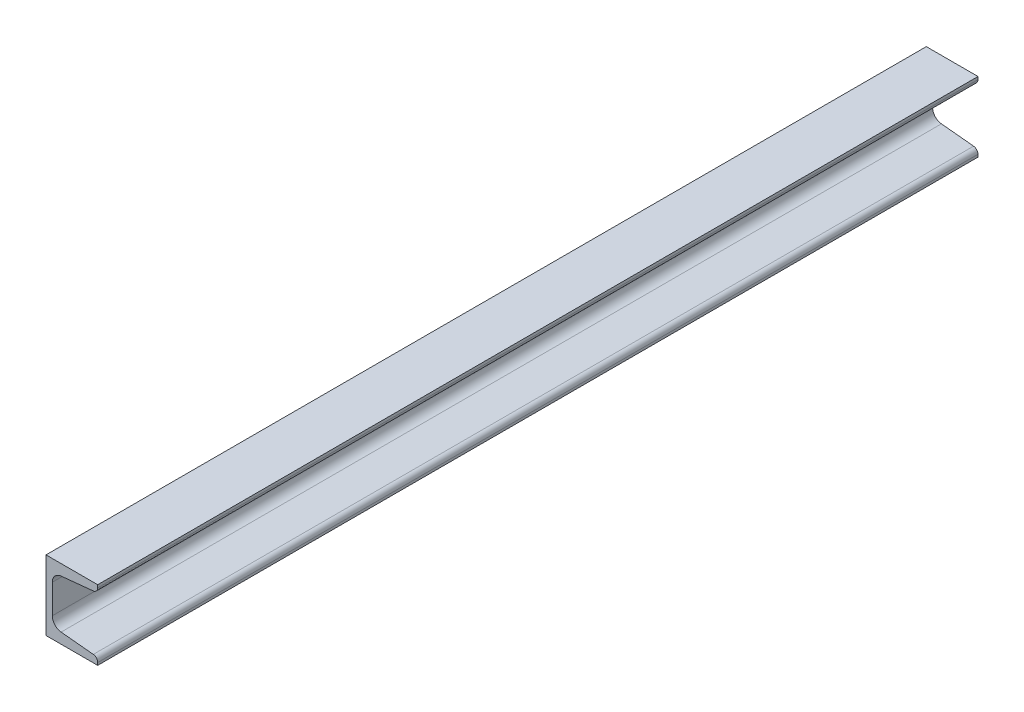
ISO-10303-21;
HEADER;
FILE_DESCRIPTION(('STEP AP214'),'2;1');
FILE_NAME('part.step','',(''),(''),'','','');
FILE_SCHEMA(('AUTOMOTIVE_DESIGN { 1 0 10303 214 1 1 1 1 }'));
ENDSEC;
DATA;
#1=APPLICATION_CONTEXT('core data for automotive mechanical design processes');
#2=APPLICATION_PROTOCOL_DEFINITION('international standard','automotive_design',2000,#1);
#3=PRODUCT_CONTEXT('',#1,'mechanical');
#4=PRODUCT('Part','Part','',(#3));
#5=PRODUCT_RELATED_PRODUCT_CATEGORY('part','',(#4));
#6=PRODUCT_DEFINITION_FORMATION('','',#4);
#7=PRODUCT_DEFINITION_CONTEXT('part definition',#1,'design');
#8=PRODUCT_DEFINITION('design','',#6,#7);
#9=PRODUCT_DEFINITION_SHAPE('','',#8);
#10=(LENGTH_UNIT() NAMED_UNIT(*) SI_UNIT(.MILLI.,.METRE.));
#11=(NAMED_UNIT(*) PLANE_ANGLE_UNIT() SI_UNIT($,.RADIAN.));
#12=(NAMED_UNIT(*) SI_UNIT($,.STERADIAN.) SOLID_ANGLE_UNIT());
#13=UNCERTAINTY_MEASURE_WITH_UNIT(LENGTH_MEASURE(1.E-05),#10,'distance_accuracy_value','');
#14=(GEOMETRIC_REPRESENTATION_CONTEXT(3) GLOBAL_UNCERTAINTY_ASSIGNED_CONTEXT((#13)) GLOBAL_UNIT_ASSIGNED_CONTEXT((#10,
#11,#12)) REPRESENTATION_CONTEXT('',''));
#15=CARTESIAN_POINT('',(0.,0.,0.));
#16=DIRECTION('',(0.,0.,1.));
#17=DIRECTION('',(1.,0.,0.));
#18=AXIS2_PLACEMENT_3D('',#15,#16,#17);
#19=CARTESIAN_POINT('',(0.,0.,630.));
#20=DIRECTION('',(0.,1.,0.));
#21=DIRECTION('',(0.,0.,1.));
#22=AXIS2_PLACEMENT_3D('',#19,#20,#21);
#23=PLANE('',#22);
#24=DIRECTION('',(1.,0.,0.));
#25=VECTOR('',#24,1.);
#26=CARTESIAN_POINT('',(0.,0.,0.));
#27=LINE('',#26,#25);
#28=CARTESIAN_POINT('',(0.,0.,0.));
#29=VERTEX_POINT('',#28);
#30=CARTESIAN_POINT('',(37.,0.,0.));
#31=VERTEX_POINT('',#30);
#32=EDGE_CURVE('E156',#29,#31,#27,.T.);
#33=ORIENTED_EDGE('',*,*,#32,.T.);
#34=DIRECTION('',(0.,0.,-1.));
#35=VECTOR('',#34,1.);
#36=CARTESIAN_POINT('',(37.,0.,630.));
#37=LINE('',#36,#35);
#38=CARTESIAN_POINT('',(37.,0.,630.));
#39=VERTEX_POINT('',#38);
#40=EDGE_CURVE('E11',#39,#31,#37,.T.);
#41=ORIENTED_EDGE('',*,*,#40,.F.);
#42=DIRECTION('',(1.,0.,0.));
#43=VECTOR('',#42,1.);
#44=CARTESIAN_POINT('',(0.,0.,630.));
#45=LINE('',#44,#43);
#46=CARTESIAN_POINT('',(0.,0.,630.));
#47=VERTEX_POINT('',#46);
#48=EDGE_CURVE('E178',#47,#39,#45,.T.);
#49=ORIENTED_EDGE('',*,*,#48,.F.);
#50=DIRECTION('',(0.,0.,-1.));
#51=VECTOR('',#50,1.);
#52=CARTESIAN_POINT('',(0.,0.,630.));
#53=LINE('',#52,#51);
#54=EDGE_CURVE('E152',#47,#29,#53,.T.);
#55=ORIENTED_EDGE('',*,*,#54,.T.);
#56=EDGE_LOOP('',(#33,#41,#49,#55));
#57=FACE_BOUND('',#56,.T.);
#58=ADVANCED_FACE('F36',(#57),#23,.F.);
#59=CARTESIAN_POINT('',(37.,0.,630.));
#60=DIRECTION('',(-1.,0.,0.));
#61=DIRECTION('',(0.,0.,1.));
#62=AXIS2_PLACEMENT_3D('',#59,#60,#61);
#63=PLANE('',#62);
#64=DIRECTION('',(0.,1.,0.));
#65=VECTOR('',#64,1.);
#66=CARTESIAN_POINT('',(37.,0.,0.));
#67=LINE('',#66,#65);
#68=CARTESIAN_POINT('',(37.,1.75754353260767,0.));
#69=VERTEX_POINT('',#68);
#70=EDGE_CURVE('E159',#31,#69,#67,.T.);
#71=ORIENTED_EDGE('',*,*,#70,.T.);
#72=DIRECTION('',(0.,0.,-1.));
#73=VECTOR('',#72,1.);
#74=CARTESIAN_POINT('',(37.,1.75754353260767,630.));
#75=LINE('',#74,#73);
#76=CARTESIAN_POINT('',(37.,1.75754353260767,630.));
#77=VERTEX_POINT('',#76);
#78=EDGE_CURVE('E44',#77,#69,#75,.T.);
#79=ORIENTED_EDGE('',*,*,#78,.F.);
#80=DIRECTION('',(0.,1.,0.));
#81=VECTOR('',#80,1.);
#82=CARTESIAN_POINT('',(37.,0.,630.));
#83=LINE('',#82,#81);
#84=EDGE_CURVE('E107',#39,#77,#83,.T.);
#85=ORIENTED_EDGE('',*,*,#84,.F.);
#86=ORIENTED_EDGE('',*,*,#40,.T.);
#87=EDGE_LOOP('',(#71,#79,#85,#86));
#88=FACE_BOUND('',#87,.T.);
#89=ADVANCED_FACE('F256',(#88),#63,.F.);
#90=CARTESIAN_POINT('',(33.5,1.75754353260769,630.));
#91=DIRECTION('',(0.,0.,-1.));
#92=DIRECTION('',(-1.,0.,0.));
#93=AXIS2_PLACEMENT_3D('',#90,#91,#92);
#94=CYLINDRICAL_SURFACE('',#93,3.5);
#95=CARTESIAN_POINT('',(33.5,1.75754353260769,0.));
#96=DIRECTION('',(0.,0.,1.));
#97=DIRECTION('',(1.,0.,0.));
#98=AXIS2_PLACEMENT_3D('',#95,#96,#97);
#99=CIRCLE('',#98,3.5);
#100=CARTESIAN_POINT('',(33.8482630165735,5.24017369834266,0.));
#101=VERTEX_POINT('',#100);
#102=EDGE_CURVE('E161',#69,#101,#99,.T.);
#103=ORIENTED_EDGE('',*,*,#102,.T.);
#104=DIRECTION('',(0.,0.,-1.));
#105=VECTOR('',#104,1.);
#106=CARTESIAN_POINT('',(33.8482630165735,5.24017369834266,630.));
#107=LINE('',#106,#105);
#108=CARTESIAN_POINT('',(33.8482630165735,5.24017369834266,630.));
#109=VERTEX_POINT('',#108);
#110=EDGE_CURVE('E197',#109,#101,#107,.T.);
#111=ORIENTED_EDGE('',*,*,#110,.F.);
#112=CARTESIAN_POINT('',(33.5,1.75754353260769,630.));
#113=DIRECTION('',(0.,0.,1.));
#114=DIRECTION('',(1.,0.,0.));
#115=AXIS2_PLACEMENT_3D('',#112,#113,#114);
#116=CIRCLE('',#115,3.5);
#117=EDGE_CURVE('E205',#77,#109,#116,.T.);
#118=ORIENTED_EDGE('',*,*,#117,.F.);
#119=ORIENTED_EDGE('',*,*,#78,.T.);
#120=EDGE_LOOP('',(#103,#111,#118,#119));
#121=FACE_BOUND('',#120,.T.);
#122=ADVANCED_FACE('F203',(#121),#94,.T.);
#123=CARTESIAN_POINT('',(10.8034739668531,7.5446526033147,630.));
#124=DIRECTION('',(-0.0995037190209989,-0.995037190209989,0.));
#125=DIRECTION('',(0.995037190209989,-0.099503719020999,0.));
#126=AXIS2_PLACEMENT_3D('',#123,#124,#125);
#127=PLANE('',#126);
#128=DIRECTION('',(-0.995037190209989,0.0995037190209989,0.));
#129=VECTOR('',#128,1.);
#130=CARTESIAN_POINT('',(10.8034739668531,7.5446526033147,0.));
#131=LINE('',#130,#129);
#132=CARTESIAN_POINT('',(10.8034739668531,7.5446526033147,0.));
#133=VERTEX_POINT('',#132);
#134=EDGE_CURVE('E163',#101,#133,#131,.T.);
#135=ORIENTED_EDGE('',*,*,#134,.T.);
#136=DIRECTION('',(0.,0.,-1.));
#137=VECTOR('',#136,1.);
#138=CARTESIAN_POINT('',(10.8034739668531,7.5446526033147,630.));
#139=LINE('',#138,#137);
#140=CARTESIAN_POINT('',(10.8034739668531,7.5446526033147,630.));
#141=VERTEX_POINT('',#140);
#142=EDGE_CURVE('E194',#141,#133,#139,.T.);
#143=ORIENTED_EDGE('',*,*,#142,.F.);
#144=DIRECTION('',(-0.995037190209989,0.0995037190209989,0.));
#145=VECTOR('',#144,1.);
#146=CARTESIAN_POINT('',(10.8034739668531,7.5446526033147,630.));
#147=LINE('',#146,#145);
#148=EDGE_CURVE('E223',#109,#141,#147,.T.);
#149=ORIENTED_EDGE('',*,*,#148,.F.);
#150=ORIENTED_EDGE('',*,*,#110,.T.);
#151=EDGE_LOOP('',(#135,#143,#149,#150));
#152=FACE_BOUND('',#151,.T.);
#153=ADVANCED_FACE('F214',(#152),#127,.F.);
#154=CARTESIAN_POINT('',(11.5,14.5099129347846,630.));
#155=DIRECTION('',(0.,0.,-1.));
#156=DIRECTION('',(-1.,0.,0.));
#157=AXIS2_PLACEMENT_3D('',#154,#155,#156);
#158=CYLINDRICAL_SURFACE('',#157,7.);
#159=CARTESIAN_POINT('',(11.5,14.5099129347846,0.));
#160=DIRECTION('',(0.,0.,-1.));
#161=DIRECTION('',(1.,0.,0.));
#162=AXIS2_PLACEMENT_3D('',#159,#160,#161);
#163=CIRCLE('',#162,7.);
#164=CARTESIAN_POINT('',(4.5,14.5099129347847,0.));
#165=VERTEX_POINT('',#164);
#166=EDGE_CURVE('E165',#133,#165,#163,.T.);
#167=ORIENTED_EDGE('',*,*,#166,.T.);
#168=DIRECTION('',(0.,0.,-1.));
#169=VECTOR('',#168,1.);
#170=CARTESIAN_POINT('',(4.5,14.5099129347847,630.));
#171=LINE('',#170,#169);
#172=CARTESIAN_POINT('',(4.5,14.5099129347847,630.));
#173=VERTEX_POINT('',#172);
#174=EDGE_CURVE('E191',#173,#165,#171,.T.);
#175=ORIENTED_EDGE('',*,*,#174,.F.);
#176=CARTESIAN_POINT('',(11.5,14.5099129347846,630.));
#177=DIRECTION('',(0.,0.,-1.));
#178=DIRECTION('',(1.,0.,0.));
#179=AXIS2_PLACEMENT_3D('',#176,#177,#178);
#180=CIRCLE('',#179,7.);
#181=EDGE_CURVE('E220',#141,#173,#180,.T.);
#182=ORIENTED_EDGE('',*,*,#181,.F.);
#183=ORIENTED_EDGE('',*,*,#142,.T.);
#184=EDGE_LOOP('',(#167,#175,#182,#183));
#185=FACE_BOUND('',#184,.T.);
#186=ADVANCED_FACE('F218',(#185),#158,.F.);
#187=CARTESIAN_POINT('',(4.5,14.5099129347847,630.));
#188=DIRECTION('',(-1.,0.,0.));
#189=DIRECTION('',(0.,-1.,0.));
#190=AXIS2_PLACEMENT_3D('',#187,#188,#189);
#191=PLANE('',#190);
#192=DIRECTION('',(0.,1.,0.));
#193=VECTOR('',#192,1.);
#194=CARTESIAN_POINT('',(4.5,14.5099129347847,0.));
#195=LINE('',#194,#193);
#196=CARTESIAN_POINT('',(4.5,35.2876429963102,0.));
#197=VERTEX_POINT('',#196);
#198=EDGE_CURVE('E167',#165,#197,#195,.T.);
#199=ORIENTED_EDGE('',*,*,#198,.T.);
#200=DIRECTION('',(0.,0.,-1.));
#201=VECTOR('',#200,1.);
#202=CARTESIAN_POINT('',(4.5,35.2876429963102,630.));
#203=LINE('',#202,#201);
#204=CARTESIAN_POINT('',(4.5,35.2876429963102,630.));
#205=VERTEX_POINT('',#204);
#206=EDGE_CURVE('E188',#205,#197,#203,.T.);
#207=ORIENTED_EDGE('',*,*,#206,.F.);
#208=DIRECTION('',(0.,1.,0.));
#209=VECTOR('',#208,1.);
#210=CARTESIAN_POINT('',(4.5,14.5099129347847,630.));
#211=LINE('',#210,#209);
#212=EDGE_CURVE('E222',#173,#205,#211,.T.);
#213=ORIENTED_EDGE('',*,*,#212,.F.);
#214=ORIENTED_EDGE('',*,*,#174,.T.);
#215=EDGE_LOOP('',(#199,#207,#213,#214));
#216=FACE_BOUND('',#215,.T.);
#217=ADVANCED_FACE('F269',(#216),#191,.F.);
#218=CARTESIAN_POINT('',(11.5,35.2876429963103,630.));
#219=DIRECTION('',(0.,0.,-1.));
#220=DIRECTION('',(-1.,0.,0.));
#221=AXIS2_PLACEMENT_3D('',#218,#219,#220);
#222=CYLINDRICAL_SURFACE('',#221,7.);
#223=CARTESIAN_POINT('',(11.5,35.2876429963103,0.));
#224=DIRECTION('',(0.,0.,-1.));
#225=DIRECTION('',(1.,0.,0.));
#226=AXIS2_PLACEMENT_3D('',#223,#224,#225);
#227=CIRCLE('',#226,7.);
#228=CARTESIAN_POINT('',(10.803473966853,42.2529033277802,0.));
#229=VERTEX_POINT('',#228);
#230=EDGE_CURVE('E169',#197,#229,#227,.T.);
#231=ORIENTED_EDGE('',*,*,#230,.T.);
#232=DIRECTION('',(0.,0.,-1.));
#233=VECTOR('',#232,1.);
#234=CARTESIAN_POINT('',(10.803473966853,42.2529033277802,630.));
#235=LINE('',#234,#233);
#236=CARTESIAN_POINT('',(10.803473966853,42.2529033277802,630.));
#237=VERTEX_POINT('',#236);
#238=EDGE_CURVE('E185',#237,#229,#235,.T.);
#239=ORIENTED_EDGE('',*,*,#238,.F.);
#240=CARTESIAN_POINT('',(11.5,35.2876429963103,630.));
#241=DIRECTION('',(0.,0.,-1.));
#242=DIRECTION('',(1.,0.,0.));
#243=AXIS2_PLACEMENT_3D('',#240,#241,#242);
#244=CIRCLE('',#243,7.);
#245=EDGE_CURVE('E225',#205,#237,#244,.T.);
#246=ORIENTED_EDGE('',*,*,#245,.F.);
#247=ORIENTED_EDGE('',*,*,#206,.T.);
#248=EDGE_LOOP('',(#231,#239,#246,#247));
#249=FACE_BOUND('',#248,.T.);
#250=ADVANCED_FACE('F272',(#249),#222,.F.);
#251=CARTESIAN_POINT('',(10.803473966853,42.2529033277802,630.));
#252=DIRECTION('',(-0.0995037190209989,0.995037190209989,0.));
#253=DIRECTION('',(-0.995037190209989,-0.0995037190209989,0.));
#254=AXIS2_PLACEMENT_3D('',#251,#252,#253);
#255=PLANE('',#254);
#256=DIRECTION('',(0.995037190209989,0.0995037190209989,0.));
#257=VECTOR('',#256,1.);
#258=CARTESIAN_POINT('',(10.803473966853,42.2529033277802,0.));
#259=LINE('',#258,#257);
#260=CARTESIAN_POINT('',(33.8482630165735,44.5573822327522,0.));
#261=VERTEX_POINT('',#260);
#262=EDGE_CURVE('E171',#229,#261,#259,.T.);
#263=ORIENTED_EDGE('',*,*,#262,.T.);
#264=DIRECTION('',(0.,0.,-1.));
#265=VECTOR('',#264,1.);
#266=CARTESIAN_POINT('',(33.8482630165735,44.5573822327522,630.));
#267=LINE('',#266,#265);
#268=CARTESIAN_POINT('',(33.8482630165735,44.5573822327522,630.));
#269=VERTEX_POINT('',#268);
#270=EDGE_CURVE('E182',#269,#261,#267,.T.);
#271=ORIENTED_EDGE('',*,*,#270,.F.);
#272=DIRECTION('',(0.995037190209989,0.0995037190209989,0.));
#273=VECTOR('',#272,1.);
#274=CARTESIAN_POINT('',(10.803473966853,42.2529033277802,630.));
#275=LINE('',#274,#273);
#276=EDGE_CURVE('E231',#237,#269,#275,.T.);
#277=ORIENTED_EDGE('',*,*,#276,.F.);
#278=ORIENTED_EDGE('',*,*,#238,.T.);
#279=EDGE_LOOP('',(#263,#271,#277,#278));
#280=FACE_BOUND('',#279,.T.);
#281=ADVANCED_FACE('F237',(#280),#255,.F.);
#282=CARTESIAN_POINT('',(33.5,48.0400123984872,630.));
#283=DIRECTION('',(0.,0.,-1.));
#284=DIRECTION('',(-1.,0.,0.));
#285=AXIS2_PLACEMENT_3D('',#282,#283,#284);
#286=CYLINDRICAL_SURFACE('',#285,3.50000000000001);
#287=CARTESIAN_POINT('',(33.5,48.0400123984872,0.));
#288=DIRECTION('',(0.,0.,1.));
#289=DIRECTION('',(1.,0.,0.));
#290=AXIS2_PLACEMENT_3D('',#287,#288,#289);
#291=CIRCLE('',#290,3.50000000000001);
#292=CARTESIAN_POINT('',(37.,48.0400123984872,0.));
#293=VERTEX_POINT('',#292);
#294=EDGE_CURVE('E173',#261,#293,#291,.T.);
#295=ORIENTED_EDGE('',*,*,#294,.T.);
#296=DIRECTION('',(0.,0.,-1.));
#297=VECTOR('',#296,1.);
#298=CARTESIAN_POINT('',(37.,48.0400123984872,630.));
#299=LINE('',#298,#297);
#300=CARTESIAN_POINT('',(37.,48.0400123984872,630.));
#301=VERTEX_POINT('',#300);
#302=EDGE_CURVE('E147',#301,#293,#299,.T.);
#303=ORIENTED_EDGE('',*,*,#302,.F.);
#304=CARTESIAN_POINT('',(33.5,48.0400123984872,630.));
#305=DIRECTION('',(0.,0.,1.));
#306=DIRECTION('',(1.,0.,0.));
#307=AXIS2_PLACEMENT_3D('',#304,#305,#306);
#308=CIRCLE('',#307,3.50000000000001);
#309=EDGE_CURVE('E138',#269,#301,#308,.T.);
#310=ORIENTED_EDGE('',*,*,#309,.F.);
#311=ORIENTED_EDGE('',*,*,#270,.T.);
#312=EDGE_LOOP('',(#295,#303,#310,#311));
#313=FACE_BOUND('',#312,.T.);
#314=ADVANCED_FACE('F241',(#313),#286,.T.);
#315=CARTESIAN_POINT('',(37.,48.0400123984872,630.));
#316=DIRECTION('',(-1.,0.,0.));
#317=DIRECTION('',(0.,0.,1.));
#318=AXIS2_PLACEMENT_3D('',#315,#316,#317);
#319=PLANE('',#318);
#320=DIRECTION('',(0.,1.,0.));
#321=VECTOR('',#320,1.);
#322=CARTESIAN_POINT('',(37.,48.0400123984872,0.));
#323=LINE('',#322,#321);
#324=CARTESIAN_POINT('',(37.,50.,0.));
#325=VERTEX_POINT('',#324);
#326=EDGE_CURVE('E146',#293,#325,#323,.T.);
#327=ORIENTED_EDGE('',*,*,#326,.T.);
#328=DIRECTION('',(0.,0.,-1.));
#329=VECTOR('',#328,1.);
#330=CARTESIAN_POINT('',(37.,50.,630.));
#331=LINE('',#330,#329);
#332=CARTESIAN_POINT('',(37.,50.,630.));
#333=VERTEX_POINT('',#332);
#334=EDGE_CURVE('E143',#333,#325,#331,.T.);
#335=ORIENTED_EDGE('',*,*,#334,.F.);
#336=DIRECTION('',(0.,1.,0.));
#337=VECTOR('',#336,1.);
#338=CARTESIAN_POINT('',(37.,48.0400123984872,630.));
#339=LINE('',#338,#337);
#340=EDGE_CURVE('E132',#301,#333,#339,.T.);
#341=ORIENTED_EDGE('',*,*,#340,.F.);
#342=ORIENTED_EDGE('',*,*,#302,.T.);
#343=EDGE_LOOP('',(#327,#335,#341,#342));
#344=FACE_BOUND('',#343,.T.);
#345=ADVANCED_FACE('F144',(#344),#319,.F.);
#346=CARTESIAN_POINT('',(-1.71512449944288E-13,50.,630.));
#347=DIRECTION('',(0.,-1.,0.));
#348=DIRECTION('',(0.,0.,-1.));
#349=AXIS2_PLACEMENT_3D('',#346,#347,#348);
#350=PLANE('',#349);
#351=DIRECTION('',(-1.,0.,0.));
#352=VECTOR('',#351,1.);
#353=CARTESIAN_POINT('',(-1.71512449944288E-13,50.,0.));
#354=LINE('',#353,#352);
#355=CARTESIAN_POINT('',(-1.71512449944288E-13,50.,0.));
#356=VERTEX_POINT('',#355);
#357=EDGE_CURVE('E93',#325,#356,#354,.T.);
#358=ORIENTED_EDGE('',*,*,#357,.T.);
#359=DIRECTION('',(0.,0.,-1.));
#360=VECTOR('',#359,1.);
#361=CARTESIAN_POINT('',(-1.71512449944288E-13,50.,630.));
#362=LINE('',#361,#360);
#363=CARTESIAN_POINT('',(-1.71512449944288E-13,50.,630.));
#364=VERTEX_POINT('',#363);
#365=EDGE_CURVE('E148',#364,#356,#362,.T.);
#366=ORIENTED_EDGE('',*,*,#365,.F.);
#367=DIRECTION('',(-1.,0.,0.));
#368=VECTOR('',#367,1.);
#369=CARTESIAN_POINT('',(-1.71512449944288E-13,50.,630.));
#370=LINE('',#369,#368);
#371=EDGE_CURVE('E136',#333,#364,#370,.T.);
#372=ORIENTED_EDGE('',*,*,#371,.F.);
#373=ORIENTED_EDGE('',*,*,#334,.T.);
#374=EDGE_LOOP('',(#358,#366,#372,#373));
#375=FACE_BOUND('',#374,.T.);
#376=ADVANCED_FACE('F150',(#375),#350,.F.);
#377=CARTESIAN_POINT('',(0.,0.,630.));
#378=DIRECTION('',(1.,0.,0.));
#379=DIRECTION('',(0.,1.,0.));
#380=AXIS2_PLACEMENT_3D('',#377,#378,#379);
#381=PLANE('',#380);
#382=DIRECTION('',(0.,-1.,0.));
#383=VECTOR('',#382,1.);
#384=CARTESIAN_POINT('',(0.,0.,0.));
#385=LINE('',#384,#383);
#386=EDGE_CURVE('E99',#356,#29,#385,.T.);
#387=ORIENTED_EDGE('',*,*,#386,.T.);
#388=ORIENTED_EDGE('',*,*,#54,.F.);
#389=DIRECTION('',(0.,-1.,0.));
#390=VECTOR('',#389,1.);
#391=CARTESIAN_POINT('',(0.,0.,630.));
#392=LINE('',#391,#390);
#393=EDGE_CURVE('E52',#364,#47,#392,.T.);
#394=ORIENTED_EDGE('',*,*,#393,.F.);
#395=ORIENTED_EDGE('',*,*,#365,.T.);
#396=EDGE_LOOP('',(#387,#388,#394,#395));
#397=FACE_BOUND('',#396,.T.);
#398=ADVANCED_FACE('F245',(#397),#381,.F.);
#399=CARTESIAN_POINT('',(33.5,1.75754353260769,630.));
#400=DIRECTION('',(0.,0.,1.));
#401=DIRECTION('',(1.,0.,0.));
#402=AXIS2_PLACEMENT_3D('',#399,#400,#401);
#403=PLANE('',#402);
#404=ORIENTED_EDGE('',*,*,#48,.T.);
#405=ORIENTED_EDGE('',*,*,#84,.T.);
#406=ORIENTED_EDGE('',*,*,#117,.T.);
#407=ORIENTED_EDGE('',*,*,#148,.T.);
#408=ORIENTED_EDGE('',*,*,#181,.T.);
#409=ORIENTED_EDGE('',*,*,#212,.T.);
#410=ORIENTED_EDGE('',*,*,#245,.T.);
#411=ORIENTED_EDGE('',*,*,#276,.T.);
#412=ORIENTED_EDGE('',*,*,#309,.T.);
#413=ORIENTED_EDGE('',*,*,#340,.T.);
#414=ORIENTED_EDGE('',*,*,#371,.T.);
#415=ORIENTED_EDGE('',*,*,#393,.T.);
#416=EDGE_LOOP('',(#404,#405,#406,#407,#408,#409,#410,#411,#412,#413,#414,#415));
#417=FACE_BOUND('',#416,.T.);
#418=ADVANCED_FACE('F134',(#417),#403,.T.);
#419=CARTESIAN_POINT('',(33.5,1.75754353260769,0.));
#420=DIRECTION('',(0.,0.,1.));
#421=DIRECTION('',(1.,0.,0.));
#422=AXIS2_PLACEMENT_3D('',#419,#420,#421);
#423=PLANE('',#422);
#424=ORIENTED_EDGE('',*,*,#32,.F.);
#425=ORIENTED_EDGE('',*,*,#386,.F.);
#426=ORIENTED_EDGE('',*,*,#357,.F.);
#427=ORIENTED_EDGE('',*,*,#326,.F.);
#428=ORIENTED_EDGE('',*,*,#294,.F.);
#429=ORIENTED_EDGE('',*,*,#262,.F.);
#430=ORIENTED_EDGE('',*,*,#230,.F.);
#431=ORIENTED_EDGE('',*,*,#198,.F.);
#432=ORIENTED_EDGE('',*,*,#166,.F.);
#433=ORIENTED_EDGE('',*,*,#134,.F.);
#434=ORIENTED_EDGE('',*,*,#102,.F.);
#435=ORIENTED_EDGE('',*,*,#70,.F.);
#436=EDGE_LOOP('',(#424,#425,#426,#427,#428,#429,#430,#431,#432,#433,#434,#435));
#437=FACE_BOUND('',#436,.T.);
#438=ADVANCED_FACE('F209',(#437),#423,.F.);
#439=CLOSED_SHELL('',(#58,#89,#122,#153,#186,#217,#250,#281,#314,#345,#376,#398,#418,#438));
#440=MANIFOLD_SOLID_BREP('B2',#439);
#441=ADVANCED_BREP_SHAPE_REPRESENTATION('',(#18,#440),#14);
#442=SHAPE_DEFINITION_REPRESENTATION(#9,#441);
ENDSEC;
END-ISO-10303-21;
